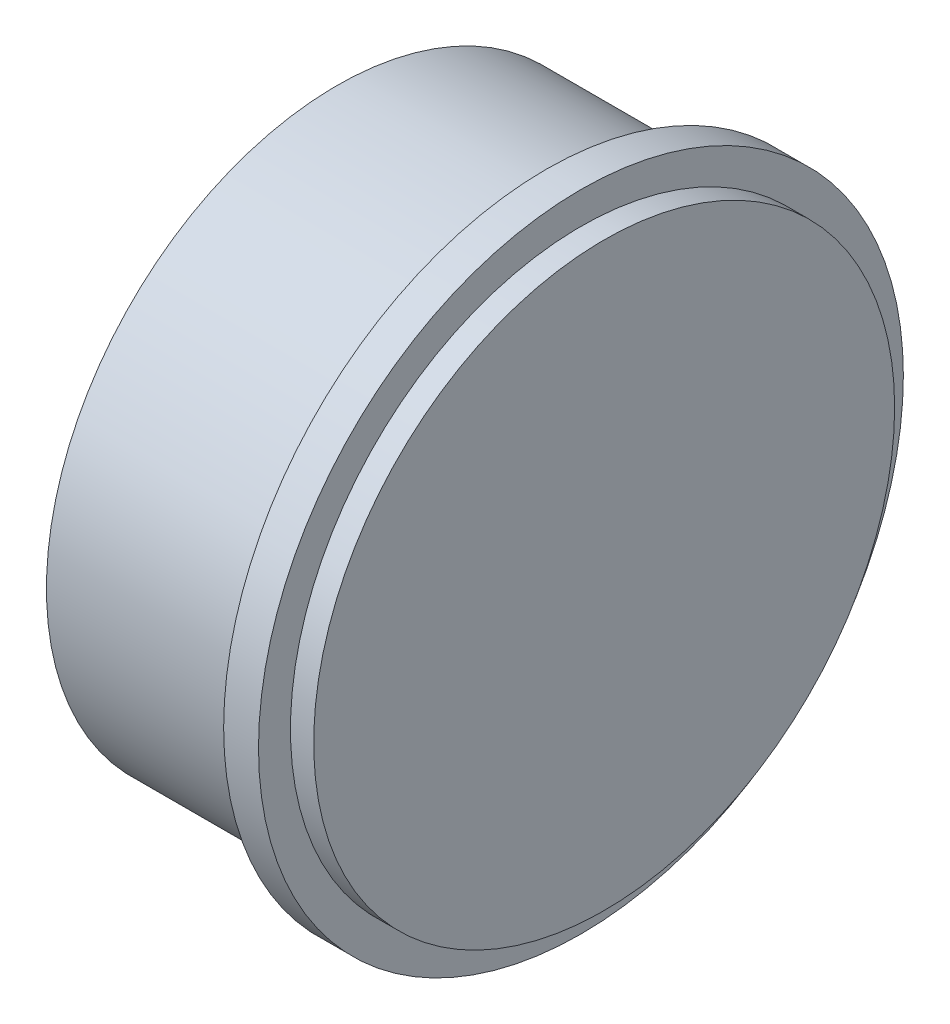
ISO-10303-21;
HEADER;
FILE_DESCRIPTION(('STEP AP214'),'2;1');
FILE_NAME('part.step','',(''),(''),'','','');
FILE_SCHEMA(('AUTOMOTIVE_DESIGN { 1 0 10303 214 1 1 1 1 }'));
ENDSEC;
DATA;
#1=APPLICATION_CONTEXT('core data for automotive mechanical design processes');
#2=APPLICATION_PROTOCOL_DEFINITION('international standard','automotive_design',2000,#1);
#3=PRODUCT_CONTEXT('',#1,'mechanical');
#4=PRODUCT('Part','Part','',(#3));
#5=PRODUCT_RELATED_PRODUCT_CATEGORY('part','',(#4));
#6=PRODUCT_DEFINITION_FORMATION('','',#4);
#7=PRODUCT_DEFINITION_CONTEXT('part definition',#1,'design');
#8=PRODUCT_DEFINITION('design','',#6,#7);
#9=PRODUCT_DEFINITION_SHAPE('','',#8);
#10=(LENGTH_UNIT() NAMED_UNIT(*) SI_UNIT(.MILLI.,.METRE.));
#11=(NAMED_UNIT(*) PLANE_ANGLE_UNIT() SI_UNIT($,.RADIAN.));
#12=(NAMED_UNIT(*) SI_UNIT($,.STERADIAN.) SOLID_ANGLE_UNIT());
#13=UNCERTAINTY_MEASURE_WITH_UNIT(LENGTH_MEASURE(1.E-05),#10,'distance_accuracy_value','');
#14=(GEOMETRIC_REPRESENTATION_CONTEXT(3) GLOBAL_UNCERTAINTY_ASSIGNED_CONTEXT((#13)) GLOBAL_UNIT_ASSIGNED_CONTEXT((#10,
#11,#12)) REPRESENTATION_CONTEXT('',''));
#15=CARTESIAN_POINT('',(0.,0.,0.));
#16=DIRECTION('',(0.,0.,1.));
#17=DIRECTION('',(1.,0.,0.));
#18=AXIS2_PLACEMENT_3D('',#15,#16,#17);
#19=CARTESIAN_POINT('',(457.2,0.,0.));
#20=DIRECTION('',(-1.,0.,0.));
#21=DIRECTION('',(0.,0.,1.));
#22=AXIS2_PLACEMENT_3D('',#19,#20,#21);
#23=CYLINDRICAL_SURFACE('',#22,635.);
#24=CARTESIAN_POINT('',(457.2,0.,0.));
#25=DIRECTION('',(1.,0.,0.));
#26=DIRECTION('',(0.,0.,-1.));
#27=AXIS2_PLACEMENT_3D('',#24,#25,#26);
#28=CIRCLE('',#27,635.);
#29=CARTESIAN_POINT('',(457.2,0.,-635.));
#30=VERTEX_POINT('',#29);
#31=EDGE_CURVE('E10',#30,#30,#28,.T.);
#32=ORIENTED_EDGE('',*,*,#31,.F.);
#33=EDGE_LOOP('',(#32));
#34=FACE_BOUND('',#33,.T.);
#35=CARTESIAN_POINT('',(0.,0.,0.));
#36=DIRECTION('',(1.,0.,0.));
#37=DIRECTION('',(0.,0.,-1.));
#38=AXIS2_PLACEMENT_3D('',#35,#36,#37);
#39=CIRCLE('',#38,635.);
#40=CARTESIAN_POINT('',(0.,0.,-635.));
#41=VERTEX_POINT('',#40);
#42=EDGE_CURVE('E35',#41,#41,#39,.T.);
#43=ORIENTED_EDGE('',*,*,#42,.T.);
#44=EDGE_LOOP('',(#43));
#45=FACE_BOUND('',#44,.T.);
#46=ADVANCED_FACE('F32',(#34,#45),#23,.T.);
#47=CARTESIAN_POINT('',(0.,0.,0.));
#48=DIRECTION('',(1.,0.,0.));
#49=DIRECTION('',(0.,0.,-1.));
#50=AXIS2_PLACEMENT_3D('',#47,#48,#49);
#51=PLANE('',#50);
#52=ORIENTED_EDGE('',*,*,#42,.F.);
#53=EDGE_LOOP('',(#52));
#54=FACE_BOUND('',#53,.T.);
#55=ADVANCED_FACE('F74',(#54),#51,.F.);
#56=CARTESIAN_POINT('',(533.4,0.,0.));
#57=DIRECTION('',(-1.,0.,0.));
#58=DIRECTION('',(0.,0.,1.));
#59=AXIS2_PLACEMENT_3D('',#56,#57,#58);
#60=CYLINDRICAL_SURFACE('',#59,704.85);
#61=CARTESIAN_POINT('',(533.4,0.,0.));
#62=DIRECTION('',(1.,0.,0.));
#63=DIRECTION('',(0.,0.,-1.));
#64=AXIS2_PLACEMENT_3D('',#61,#62,#63);
#65=CIRCLE('',#64,704.85);
#66=CARTESIAN_POINT('',(533.4,0.,704.85));
#67=VERTEX_POINT('',#66);
#68=EDGE_CURVE('E42',#67,#67,#65,.T.);
#69=CARTESIAN_POINT('',(457.2,0.,0.));
#70=DIRECTION('',(1.,0.,0.));
#71=DIRECTION('',(0.,0.,-1.));
#72=AXIS2_PLACEMENT_3D('',#69,#70,#71);
#73=CIRCLE('',#72,704.85);
#74=CARTESIAN_POINT('',(457.2,0.,704.85));
#75=VERTEX_POINT('',#74);
#76=EDGE_CURVE('E44',#75,#75,#73,.T.);
#77=CARTESIAN_POINT('',(533.4,0.,704.85));
#78=CARTESIAN_POINT('',(532.60625,0.,704.85));
#79=CARTESIAN_POINT('',(531.8125,0.,704.85));
#80=CARTESIAN_POINT('',(530.225,0.,704.85));
#81=CARTESIAN_POINT('',(529.43125,0.,704.85));
#82=CARTESIAN_POINT('',(527.84375,0.,704.85));
#83=CARTESIAN_POINT('',(527.05,0.,704.85));
#84=CARTESIAN_POINT('',(525.4625,0.,704.85));
#85=CARTESIAN_POINT('',(524.66875,0.,704.85));
#86=CARTESIAN_POINT('',(523.08125,0.,704.85));
#87=CARTESIAN_POINT('',(522.2875,0.,704.85));
#88=CARTESIAN_POINT('',(520.7,0.,704.85));
#89=CARTESIAN_POINT('',(519.90625,0.,704.85));
#90=CARTESIAN_POINT('',(518.31875,0.,704.85));
#91=CARTESIAN_POINT('',(517.525,0.,704.85));
#92=CARTESIAN_POINT('',(515.9375,0.,704.85));
#93=CARTESIAN_POINT('',(515.14375,0.,704.85));
#94=CARTESIAN_POINT('',(513.55625,0.,704.85));
#95=CARTESIAN_POINT('',(512.7625,0.,704.85));
#96=CARTESIAN_POINT('',(511.175,0.,704.85));
#97=CARTESIAN_POINT('',(510.38125,0.,704.85));
#98=CARTESIAN_POINT('',(508.79375,0.,704.85));
#99=CARTESIAN_POINT('',(508.,0.,704.85));
#100=CARTESIAN_POINT('',(506.4125,0.,704.85));
#101=CARTESIAN_POINT('',(505.61875,0.,704.85));
#102=CARTESIAN_POINT('',(504.03125,0.,704.85));
#103=CARTESIAN_POINT('',(503.2375,0.,704.85));
#104=CARTESIAN_POINT('',(501.65,0.,704.85));
#105=CARTESIAN_POINT('',(500.85625,0.,704.85));
#106=CARTESIAN_POINT('',(499.26875,0.,704.85));
#107=CARTESIAN_POINT('',(498.475,0.,704.85));
#108=CARTESIAN_POINT('',(496.8875,0.,704.85));
#109=CARTESIAN_POINT('',(496.09375,0.,704.85));
#110=CARTESIAN_POINT('',(494.50625,0.,704.85));
#111=CARTESIAN_POINT('',(493.7125,0.,704.85));
#112=CARTESIAN_POINT('',(492.125,0.,704.85));
#113=CARTESIAN_POINT('',(491.33125,0.,704.85));
#114=CARTESIAN_POINT('',(489.74375,0.,704.85));
#115=CARTESIAN_POINT('',(488.95,0.,704.85));
#116=CARTESIAN_POINT('',(487.3625,0.,704.85));
#117=CARTESIAN_POINT('',(486.56875,0.,704.85));
#118=CARTESIAN_POINT('',(484.98125,0.,704.85));
#119=CARTESIAN_POINT('',(484.1875,0.,704.85));
#120=CARTESIAN_POINT('',(482.6,0.,704.85));
#121=CARTESIAN_POINT('',(481.80625,0.,704.85));
#122=CARTESIAN_POINT('',(480.21875,0.,704.85));
#123=CARTESIAN_POINT('',(479.425,0.,704.85));
#124=CARTESIAN_POINT('',(477.8375,0.,704.85));
#125=CARTESIAN_POINT('',(477.04375,0.,704.85));
#126=CARTESIAN_POINT('',(475.45625,0.,704.85));
#127=CARTESIAN_POINT('',(474.6625,0.,704.85));
#128=CARTESIAN_POINT('',(473.075,0.,704.85));
#129=CARTESIAN_POINT('',(472.28125,0.,704.85));
#130=CARTESIAN_POINT('',(470.69375,0.,704.85));
#131=CARTESIAN_POINT('',(469.9,0.,704.85));
#132=CARTESIAN_POINT('',(468.3125,0.,704.85));
#133=CARTESIAN_POINT('',(467.51875,0.,704.85));
#134=CARTESIAN_POINT('',(465.93125,0.,704.85));
#135=CARTESIAN_POINT('',(465.1375,0.,704.85));
#136=CARTESIAN_POINT('',(463.55,0.,704.85));
#137=CARTESIAN_POINT('',(462.75625,0.,704.85));
#138=CARTESIAN_POINT('',(461.16875,0.,704.85));
#139=CARTESIAN_POINT('',(460.375,0.,704.85));
#140=CARTESIAN_POINT('',(458.7875,0.,704.85));
#141=CARTESIAN_POINT('',(457.99375,0.,704.85));
#142=CARTESIAN_POINT('',(457.2,0.,704.85));
#143=B_SPLINE_CURVE_WITH_KNOTS('',3,(#77,#78,#79,#80,#81,#82,#83,#84,#85,#86,#87,#88,#89,#90,
#91,#92,#93,#94,#95,#96,#97,#98,#99,#100,#101,#102,#103,#104,#105,#106,#107,#108,#109,#110,#111,
#112,#113,#114,#115,#116,#117,#118,#119,#120,#121,#122,#123,#124,#125,#126,#127,#128,#129,#130,
#131,#132,#133,#134,#135,#136,#137,#138,#139,#140,#141,#142),.UNSPECIFIED.,.F.,.F.,(4,2,2,2,2,2,
2,2,2,2,2,2,2,2,2,2,2,2,2,2,2,2,2,2,2,2,2,2,2,2,2,2,4),(0.,2.38125,4.7625,7.14375,
9.52500000000001,11.90625,14.2875,16.66875,19.05,21.43125,23.8125,26.19375,28.575,30.95625,
33.3375,35.71875,38.1,40.48125,42.8625,45.24375,47.625,50.00625,52.3875,54.76875,57.15,59.53125,
61.9125,64.29375,66.675,69.05625,71.4375,73.81875,76.2),.UNSPECIFIED.);
#144=EDGE_CURVE('BSEAM68',#67,#75,#143,.T.);
#145=ORIENTED_EDGE('',*,*,#68,.F.);
#146=ORIENTED_EDGE('',*,*,#76,.T.);
#147=ORIENTED_EDGE('',*,*,#144,.T.);
#148=ORIENTED_EDGE('',*,*,#144,.F.);
#149=EDGE_LOOP('',(#145,#147,#146,#148));
#150=FACE_BOUND('',#149,.T.);
#151=ADVANCED_FACE('F68',(#150),#60,.T.);
#152=CARTESIAN_POINT('',(533.4,0.,0.));
#153=DIRECTION('',(1.,0.,0.));
#154=DIRECTION('',(0.,0.,-1.));
#155=AXIS2_PLACEMENT_3D('',#152,#153,#154);
#156=PLANE('',#155);
#157=CARTESIAN_POINT('',(533.4,0.,0.));
#158=DIRECTION('',(1.,0.,0.));
#159=DIRECTION('',(0.,0.,-1.));
#160=AXIS2_PLACEMENT_3D('',#157,#158,#159);
#161=CIRCLE('',#160,635.);
#162=CARTESIAN_POINT('',(533.4,0.,-635.));
#163=VERTEX_POINT('',#162);
#164=EDGE_CURVE('E50',#163,#163,#161,.T.);
#165=ORIENTED_EDGE('',*,*,#164,.F.);
#166=EDGE_LOOP('',(#165));
#167=FACE_BOUND('',#166,.T.);
#168=ORIENTED_EDGE('',*,*,#68,.T.);
#169=EDGE_LOOP('',(#168));
#170=FACE_BOUND('',#169,.T.);
#171=ADVANCED_FACE('F65',(#167,#170),#156,.T.);
#172=CARTESIAN_POINT('',(457.2,0.,0.));
#173=DIRECTION('',(1.,0.,0.));
#174=DIRECTION('',(0.,0.,-1.));
#175=AXIS2_PLACEMENT_3D('',#172,#173,#174);
#176=PLANE('',#175);
#177=ORIENTED_EDGE('',*,*,#31,.T.);
#178=EDGE_LOOP('',(#177));
#179=FACE_BOUND('',#178,.T.);
#180=ORIENTED_EDGE('',*,*,#76,.F.);
#181=EDGE_LOOP('',(#180));
#182=FACE_BOUND('',#181,.T.);
#183=ADVANCED_FACE('F61',(#179,#182),#176,.F.);
#184=CARTESIAN_POINT('',(584.2,0.,0.));
#185=DIRECTION('',(-1.,0.,0.));
#186=DIRECTION('',(0.,0.,1.));
#187=AXIS2_PLACEMENT_3D('',#184,#185,#186);
#188=CYLINDRICAL_SURFACE('',#187,635.);
#189=CARTESIAN_POINT('',(584.2,0.,0.));
#190=DIRECTION('',(1.,0.,0.));
#191=DIRECTION('',(0.,0.,-1.));
#192=AXIS2_PLACEMENT_3D('',#189,#190,#191);
#193=CIRCLE('',#192,635.);
#194=CARTESIAN_POINT('',(584.2,0.,-635.));
#195=VERTEX_POINT('',#194);
#196=EDGE_CURVE('E47',#195,#195,#193,.T.);
#197=ORIENTED_EDGE('',*,*,#196,.F.);
#198=EDGE_LOOP('',(#197));
#199=FACE_BOUND('',#198,.T.);
#200=ORIENTED_EDGE('',*,*,#164,.T.);
#201=EDGE_LOOP('',(#200));
#202=FACE_BOUND('',#201,.T.);
#203=ADVANCED_FACE('F58',(#199,#202),#188,.T.);
#204=CARTESIAN_POINT('',(584.2,0.,0.));
#205=DIRECTION('',(1.,0.,0.));
#206=DIRECTION('',(0.,0.,-1.));
#207=AXIS2_PLACEMENT_3D('',#204,#205,#206);
#208=PLANE('',#207);
#209=ORIENTED_EDGE('',*,*,#196,.T.);
#210=EDGE_LOOP('',(#209));
#211=FACE_BOUND('',#210,.T.);
#212=ADVANCED_FACE('F56',(#211),#208,.T.);
#213=CLOSED_SHELL('',(#46,#55,#151,#171,#183,#203,#212));
#214=MANIFOLD_SOLID_BREP('B2',#213);
#215=ADVANCED_BREP_SHAPE_REPRESENTATION('',(#18,#214),#14);
#216=SHAPE_DEFINITION_REPRESENTATION(#9,#215);
ENDSEC;
END-ISO-10303-21;
